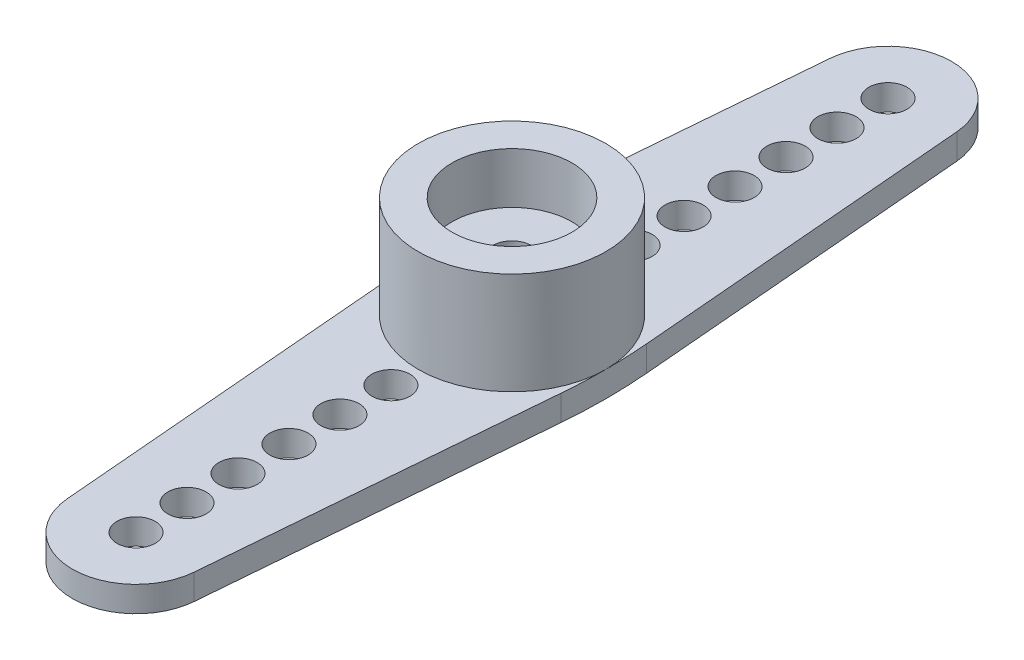
ISO-10303-21;
HEADER;
FILE_DESCRIPTION(('STEP AP214'),'2;1');
FILE_NAME('part.step','',(''),(''),'','','');
FILE_SCHEMA(('AUTOMOTIVE_DESIGN { 1 0 10303 214 1 1 1 1 }'));
ENDSEC;
DATA;
#1=APPLICATION_CONTEXT('core data for automotive mechanical design processes');
#2=APPLICATION_PROTOCOL_DEFINITION('international standard','automotive_design',2000,#1);
#3=PRODUCT_CONTEXT('',#1,'mechanical');
#4=PRODUCT('Part','Part','',(#3));
#5=PRODUCT_RELATED_PRODUCT_CATEGORY('part','',(#4));
#6=PRODUCT_DEFINITION_FORMATION('','',#4);
#7=PRODUCT_DEFINITION_CONTEXT('part definition',#1,'design');
#8=PRODUCT_DEFINITION('design','',#6,#7);
#9=PRODUCT_DEFINITION_SHAPE('','',#8);
#10=(LENGTH_UNIT() NAMED_UNIT(*) SI_UNIT(.MILLI.,.METRE.));
#11=(NAMED_UNIT(*) PLANE_ANGLE_UNIT() SI_UNIT($,.RADIAN.));
#12=(NAMED_UNIT(*) SI_UNIT($,.STERADIAN.) SOLID_ANGLE_UNIT());
#13=UNCERTAINTY_MEASURE_WITH_UNIT(LENGTH_MEASURE(1.E-05),#10,'distance_accuracy_value','');
#14=(GEOMETRIC_REPRESENTATION_CONTEXT(3) GLOBAL_UNCERTAINTY_ASSIGNED_CONTEXT((#13)) GLOBAL_UNIT_ASSIGNED_CONTEXT((#10,
#11,#12)) REPRESENTATION_CONTEXT('',''));
#15=CARTESIAN_POINT('',(0.,0.,0.));
#16=DIRECTION('',(0.,0.,1.));
#17=DIRECTION('',(1.,0.,0.));
#18=AXIS2_PLACEMENT_3D('',#15,#16,#17);
#19=CARTESIAN_POINT('',(0.,5.,0.));
#20=DIRECTION('',(0.,-1.,0.));
#21=DIRECTION('',(0.,0.,-1.));
#22=AXIS2_PLACEMENT_3D('',#19,#20,#21);
#23=CYLINDRICAL_SURFACE('',#22,0.75);
#24=CARTESIAN_POINT('',(0.,0.5,0.));
#25=DIRECTION('',(0.,-1.,0.));
#26=DIRECTION('',(0.,0.,-1.));
#27=AXIS2_PLACEMENT_3D('',#24,#25,#26);
#28=CIRCLE('',#27,0.75);
#29=CARTESIAN_POINT('',(0.,0.5,-0.75));
#30=VERTEX_POINT('',#29);
#31=EDGE_CURVE('E175',#30,#30,#28,.F.);
#32=ORIENTED_EDGE('',*,*,#31,.F.);
#33=EDGE_LOOP('',(#32));
#34=FACE_BOUND('',#33,.T.);
#35=CARTESIAN_POINT('',(0.,3.,0.));
#36=DIRECTION('',(0.,1.,0.));
#37=DIRECTION('',(0.,0.,1.));
#38=AXIS2_PLACEMENT_3D('',#35,#36,#37);
#39=CIRCLE('',#38,0.75);
#40=CARTESIAN_POINT('',(0.,3.,0.75));
#41=VERTEX_POINT('',#40);
#42=EDGE_CURVE('E40',#41,#41,#39,.T.);
#43=ORIENTED_EDGE('',*,*,#42,.T.);
#44=EDGE_LOOP('',(#43));
#45=FACE_BOUND('',#44,.T.);
#46=ADVANCED_FACE('F36',(#34,#45),#23,.F.);
#47=CARTESIAN_POINT('',(0.,1.,-14.75));
#48=DIRECTION('',(0.,-1.,0.));
#49=DIRECTION('',(0.,0.,-1.));
#50=AXIS2_PLACEMENT_3D('',#47,#48,#49);
#51=PLANE('',#50);
#52=CARTESIAN_POINT('',(0.,1.,14.75));
#53=DIRECTION('',(0.,1.,0.));
#54=DIRECTION('',(0.,0.,-1.));
#55=AXIS2_PLACEMENT_3D('',#52,#53,#54);
#56=CIRCLE('',#55,0.75);
#57=CARTESIAN_POINT('',(0.,1.,14.));
#58=VERTEX_POINT('',#57);
#59=EDGE_CURVE('E202',#58,#58,#56,.T.);
#60=ORIENTED_EDGE('',*,*,#59,.F.);
#61=EDGE_LOOP('',(#60));
#62=FACE_BOUND('',#61,.T.);
#63=CARTESIAN_POINT('',(0.,1.,12.75));
#64=DIRECTION('',(0.,1.,0.));
#65=DIRECTION('',(0.,0.,-1.));
#66=AXIS2_PLACEMENT_3D('',#63,#64,#65);
#67=CIRCLE('',#66,0.75);
#68=CARTESIAN_POINT('',(0.,1.,12.));
#69=VERTEX_POINT('',#68);
#70=EDGE_CURVE('E209',#69,#69,#67,.T.);
#71=ORIENTED_EDGE('',*,*,#70,.F.);
#72=EDGE_LOOP('',(#71));
#73=FACE_BOUND('',#72,.T.);
#74=CARTESIAN_POINT('',(0.,1.,10.75));
#75=DIRECTION('',(0.,1.,0.));
#76=DIRECTION('',(0.,0.,-1.));
#77=AXIS2_PLACEMENT_3D('',#74,#75,#76);
#78=CIRCLE('',#77,0.75);
#79=CARTESIAN_POINT('',(0.,1.,10.));
#80=VERTEX_POINT('',#79);
#81=EDGE_CURVE('E215',#80,#80,#78,.T.);
#82=ORIENTED_EDGE('',*,*,#81,.F.);
#83=EDGE_LOOP('',(#82));
#84=FACE_BOUND('',#83,.T.);
#85=CARTESIAN_POINT('',(0.,1.,8.75));
#86=DIRECTION('',(0.,1.,0.));
#87=DIRECTION('',(0.,0.,-1.));
#88=AXIS2_PLACEMENT_3D('',#85,#86,#87);
#89=CIRCLE('',#88,0.75);
#90=CARTESIAN_POINT('',(0.,1.,8.));
#91=VERTEX_POINT('',#90);
#92=EDGE_CURVE('E221',#91,#91,#89,.T.);
#93=ORIENTED_EDGE('',*,*,#92,.F.);
#94=EDGE_LOOP('',(#93));
#95=FACE_BOUND('',#94,.T.);
#96=CARTESIAN_POINT('',(0.,1.,6.75));
#97=DIRECTION('',(0.,1.,0.));
#98=DIRECTION('',(0.,0.,-1.));
#99=AXIS2_PLACEMENT_3D('',#96,#97,#98);
#100=CIRCLE('',#99,0.75);
#101=CARTESIAN_POINT('',(0.,1.,6.));
#102=VERTEX_POINT('',#101);
#103=EDGE_CURVE('E227',#102,#102,#100,.T.);
#104=ORIENTED_EDGE('',*,*,#103,.F.);
#105=EDGE_LOOP('',(#104));
#106=FACE_BOUND('',#105,.T.);
#107=CARTESIAN_POINT('',(1.04744440165294E-13,1.,4.75));
#108=DIRECTION('',(0.,1.,0.));
#109=DIRECTION('',(0.,0.,-1.));
#110=AXIS2_PLACEMENT_3D('',#107,#108,#109);
#111=CIRCLE('',#110,0.75);
#112=CARTESIAN_POINT('',(1.04744440165294E-13,1.,4.));
#113=VERTEX_POINT('',#112);
#114=EDGE_CURVE('E233',#113,#113,#111,.T.);
#115=ORIENTED_EDGE('',*,*,#114,.F.);
#116=EDGE_LOOP('',(#115));
#117=FACE_BOUND('',#116,.T.);
#118=CARTESIAN_POINT('',(-16.3206818802518,1.,0.));
#119=DIRECTION('',(0.,1.,0.));
#120=DIRECTION('',(0.,0.,1.));
#121=AXIS2_PLACEMENT_3D('',#118,#119,#120);
#122=CIRCLE('',#121,20.);
#123=CARTESIAN_POINT('',(3.60888515621104,1.,1.67700856859233));
#124=VERTEX_POINT('',#123);
#125=CARTESIAN_POINT('',(3.67931811974816,1.,0.));
#126=VERTEX_POINT('',#125);
#127=EDGE_CURVE('E122',#124,#126,#122,.T.);
#128=ORIENTED_EDGE('',*,*,#127,.T.);
#129=CARTESIAN_POINT('',(0.,1.,0.));
#130=DIRECTION('',(0.,-1.,0.));
#131=DIRECTION('',(0.,0.,-1.));
#132=AXIS2_PLACEMENT_3D('',#129,#130,#131);
#133=CIRCLE('',#132,3.67931811974816);
#134=CARTESIAN_POINT('',(-3.67931811974816,1.,0.));
#135=VERTEX_POINT('',#134);
#136=EDGE_CURVE('E52',#126,#135,#133,.T.);
#137=ORIENTED_EDGE('',*,*,#136,.T.);
#138=CARTESIAN_POINT('',(16.3206818802518,1.,0.));
#139=DIRECTION('',(0.,1.,0.));
#140=DIRECTION('',(0.,0.,1.));
#141=AXIS2_PLACEMENT_3D('',#138,#139,#140);
#142=CIRCLE('',#141,20.);
#143=CARTESIAN_POINT('',(-3.60888515621104,1.,1.67700856859234));
#144=VERTEX_POINT('',#143);
#145=EDGE_CURVE('E275',#135,#144,#142,.T.);
#146=ORIENTED_EDGE('',*,*,#145,.T.);
#147=DIRECTION('',(0.0838504284296133,0.,0.996478351823144));
#148=VECTOR('',#147,1.);
#149=CARTESIAN_POINT('',(-3.60888515621104,1.,1.67700856859233));
#150=LINE('',#149,#148);
#151=CARTESIAN_POINT('',(-2.49119587955786,1.,14.959626071074));
#152=VERTEX_POINT('',#151);
#153=EDGE_CURVE('E279',#144,#152,#150,.T.);
#154=ORIENTED_EDGE('',*,*,#153,.T.);
#155=CARTESIAN_POINT('',(0.,1.,14.75));
#156=DIRECTION('',(0.,1.,0.));
#157=DIRECTION('',(0.,0.,1.));
#158=AXIS2_PLACEMENT_3D('',#155,#156,#157);
#159=CIRCLE('',#158,2.49999999999999);
#160=CARTESIAN_POINT('',(2.49119587955786,1.,14.959626071074));
#161=VERTEX_POINT('',#160);
#162=EDGE_CURVE('E124',#152,#161,#159,.T.);
#163=ORIENTED_EDGE('',*,*,#162,.T.);
#164=DIRECTION('',(0.0838504284296133,0.,-0.996478351823144));
#165=VECTOR('',#164,1.);
#166=CARTESIAN_POINT('',(3.60888515621104,1.,1.67700856859233));
#167=LINE('',#166,#165);
#168=EDGE_CURVE('E118',#161,#124,#167,.T.);
#169=ORIENTED_EDGE('',*,*,#168,.T.);
#170=EDGE_LOOP('',(#128,#137,#146,#154,#163,#169));
#171=FACE_BOUND('',#170,.T.);
#172=ADVANCED_FACE('F120',(#62,#73,#84,#95,#106,#117,#171),#51,.F.);
#173=CARTESIAN_POINT('',(-3.60888515621104,1.,-1.67700856859233));
#174=VERTEX_POINT('',#173);
#175=EDGE_CURVE('E276',#174,#135,#142,.T.);
#176=ORIENTED_EDGE('',*,*,#175,.T.);
#177=EDGE_CURVE('E200',#135,#126,#133,.T.);
#178=ORIENTED_EDGE('',*,*,#177,.T.);
#179=CARTESIAN_POINT('',(3.60888515621104,1.,-1.67700856859233));
#180=VERTEX_POINT('',#179);
#181=EDGE_CURVE('E128',#126,#180,#122,.T.);
#182=ORIENTED_EDGE('',*,*,#181,.T.);
#183=DIRECTION('',(-0.083850428429613,0.,-0.996478351823144));
#184=VECTOR('',#183,1.);
#185=CARTESIAN_POINT('',(2.49119587955786,1.,-14.959626071074));
#186=LINE('',#185,#184);
#187=CARTESIAN_POINT('',(2.49119587955786,1.,-14.959626071074));
#188=VERTEX_POINT('',#187);
#189=EDGE_CURVE('E61',#180,#188,#186,.T.);
#190=ORIENTED_EDGE('',*,*,#189,.T.);
#191=CARTESIAN_POINT('',(0.,1.,-14.75));
#192=DIRECTION('',(0.,1.,0.));
#193=DIRECTION('',(0.,0.,-1.));
#194=AXIS2_PLACEMENT_3D('',#191,#192,#193);
#195=CIRCLE('',#194,2.5);
#196=CARTESIAN_POINT('',(-2.49119587955786,1.,-14.959626071074));
#197=VERTEX_POINT('',#196);
#198=EDGE_CURVE('E164',#188,#197,#195,.T.);
#199=ORIENTED_EDGE('',*,*,#198,.T.);
#200=DIRECTION('',(-0.083850428429613,0.,0.996478351823144));
#201=VECTOR('',#200,1.);
#202=CARTESIAN_POINT('',(-2.49119587955786,1.,-14.959626071074));
#203=LINE('',#202,#201);
#204=EDGE_CURVE('E102',#197,#174,#203,.T.);
#205=ORIENTED_EDGE('',*,*,#204,.T.);
#206=EDGE_LOOP('',(#176,#178,#182,#190,#199,#205));
#207=FACE_BOUND('',#206,.T.);
#208=CARTESIAN_POINT('',(0.,1.,-14.75));
#209=DIRECTION('',(0.,1.,0.));
#210=DIRECTION('',(0.,0.,1.));
#211=AXIS2_PLACEMENT_3D('',#208,#209,#210);
#212=CIRCLE('',#211,0.75);
#213=CARTESIAN_POINT('',(0.,1.,-14.));
#214=VERTEX_POINT('',#213);
#215=EDGE_CURVE('E152',#214,#214,#212,.T.);
#216=ORIENTED_EDGE('',*,*,#215,.F.);
#217=EDGE_LOOP('',(#216));
#218=FACE_BOUND('',#217,.T.);
#219=CARTESIAN_POINT('',(0.,1.,-12.75));
#220=DIRECTION('',(0.,1.,0.));
#221=DIRECTION('',(0.,0.,1.));
#222=AXIS2_PLACEMENT_3D('',#219,#220,#221);
#223=CIRCLE('',#222,0.750000000000019);
#224=CARTESIAN_POINT('',(0.,1.,-12.));
#225=VERTEX_POINT('',#224);
#226=EDGE_CURVE('E263',#225,#225,#223,.T.);
#227=ORIENTED_EDGE('',*,*,#226,.F.);
#228=EDGE_LOOP('',(#227));
#229=FACE_BOUND('',#228,.T.);
#230=CARTESIAN_POINT('',(0.,1.,-10.75));
#231=DIRECTION('',(0.,1.,0.));
#232=DIRECTION('',(0.,0.,1.));
#233=AXIS2_PLACEMENT_3D('',#230,#231,#232);
#234=CIRCLE('',#233,0.75);
#235=CARTESIAN_POINT('',(0.,1.,-10.));
#236=VERTEX_POINT('',#235);
#237=EDGE_CURVE('E257',#236,#236,#234,.T.);
#238=ORIENTED_EDGE('',*,*,#237,.F.);
#239=EDGE_LOOP('',(#238));
#240=FACE_BOUND('',#239,.T.);
#241=CARTESIAN_POINT('',(0.,1.,-8.75));
#242=DIRECTION('',(0.,1.,0.));
#243=DIRECTION('',(0.,0.,1.));
#244=AXIS2_PLACEMENT_3D('',#241,#242,#243);
#245=CIRCLE('',#244,0.75);
#246=CARTESIAN_POINT('',(0.,1.,-8.));
#247=VERTEX_POINT('',#246);
#248=EDGE_CURVE('E251',#247,#247,#245,.T.);
#249=ORIENTED_EDGE('',*,*,#248,.F.);
#250=EDGE_LOOP('',(#249));
#251=FACE_BOUND('',#250,.T.);
#252=CARTESIAN_POINT('',(0.,1.,-6.75));
#253=DIRECTION('',(0.,1.,0.));
#254=DIRECTION('',(0.,0.,1.));
#255=AXIS2_PLACEMENT_3D('',#252,#253,#254);
#256=CIRCLE('',#255,0.75);
#257=CARTESIAN_POINT('',(0.,1.,-6.));
#258=VERTEX_POINT('',#257);
#259=EDGE_CURVE('E245',#258,#258,#256,.T.);
#260=ORIENTED_EDGE('',*,*,#259,.F.);
#261=EDGE_LOOP('',(#260));
#262=FACE_BOUND('',#261,.T.);
#263=CARTESIAN_POINT('',(1.04744440165294E-13,1.,-4.75));
#264=DIRECTION('',(0.,1.,0.));
#265=DIRECTION('',(0.,0.,1.));
#266=AXIS2_PLACEMENT_3D('',#263,#264,#265);
#267=CIRCLE('',#266,0.75);
#268=CARTESIAN_POINT('',(1.04744440165294E-13,1.,-4.));
#269=VERTEX_POINT('',#268);
#270=EDGE_CURVE('E239',#269,#269,#267,.T.);
#271=ORIENTED_EDGE('',*,*,#270,.F.);
#272=EDGE_LOOP('',(#271));
#273=FACE_BOUND('',#272,.T.);
#274=ADVANCED_FACE('F298',(#207,#218,#229,#240,#251,#262,#273),#51,.F.);
#275=CARTESIAN_POINT('',(0.,0.,-14.75));
#276=DIRECTION('',(0.,-1.,0.));
#277=DIRECTION('',(0.,0.,-1.));
#278=AXIS2_PLACEMENT_3D('',#275,#276,#277);
#279=PLANE('',#278);
#280=CARTESIAN_POINT('',(0.,0.,0.));
#281=DIRECTION('',(0.,-1.,0.));
#282=DIRECTION('',(0.,0.,-1.));
#283=AXIS2_PLACEMENT_3D('',#280,#281,#282);
#284=CIRCLE('',#283,1.5);
#285=CARTESIAN_POINT('',(0.,0.,-1.5));
#286=VERTEX_POINT('',#285);
#287=EDGE_CURVE('E177',#286,#286,#284,.T.);
#288=ORIENTED_EDGE('',*,*,#287,.F.);
#289=EDGE_LOOP('',(#288));
#290=FACE_BOUND('',#289,.T.);
#291=DIRECTION('',(-0.083850428429613,0.,-0.996478351823144));
#292=VECTOR('',#291,1.);
#293=CARTESIAN_POINT('',(2.49119587955786,0.,-14.959626071074));
#294=LINE('',#293,#292);
#295=CARTESIAN_POINT('',(3.60888515621104,0.,-1.67700856859233));
#296=VERTEX_POINT('',#295);
#297=CARTESIAN_POINT('',(2.49119587955786,0.,-14.959626071074));
#298=VERTEX_POINT('',#297);
#299=EDGE_CURVE('E94',#296,#298,#294,.T.);
#300=ORIENTED_EDGE('',*,*,#299,.F.);
#301=CARTESIAN_POINT('',(-16.3206818802518,0.,0.));
#302=DIRECTION('',(0.,1.,0.));
#303=DIRECTION('',(0.,0.,1.));
#304=AXIS2_PLACEMENT_3D('',#301,#302,#303);
#305=CIRCLE('',#304,20.);
#306=CARTESIAN_POINT('',(3.60888515621104,0.,1.67700856859233));
#307=VERTEX_POINT('',#306);
#308=EDGE_CURVE('E161',#307,#296,#305,.T.);
#309=ORIENTED_EDGE('',*,*,#308,.F.);
#310=DIRECTION('',(0.0838504284296133,0.,-0.996478351823144));
#311=VECTOR('',#310,1.);
#312=CARTESIAN_POINT('',(3.60888515621104,0.,1.67700856859233));
#313=LINE('',#312,#311);
#314=CARTESIAN_POINT('',(2.49119587955786,0.,14.959626071074));
#315=VERTEX_POINT('',#314);
#316=EDGE_CURVE('E134',#315,#307,#313,.T.);
#317=ORIENTED_EDGE('',*,*,#316,.F.);
#318=CARTESIAN_POINT('',(0.,0.,14.75));
#319=DIRECTION('',(0.,1.,0.));
#320=DIRECTION('',(0.,0.,1.));
#321=AXIS2_PLACEMENT_3D('',#318,#319,#320);
#322=CIRCLE('',#321,2.49999999999999);
#323=CARTESIAN_POINT('',(-2.49119587955786,0.,14.959626071074));
#324=VERTEX_POINT('',#323);
#325=EDGE_CURVE('E158',#324,#315,#322,.T.);
#326=ORIENTED_EDGE('',*,*,#325,.F.);
#327=DIRECTION('',(0.0838504284296133,0.,0.996478351823144));
#328=VECTOR('',#327,1.);
#329=CARTESIAN_POINT('',(-3.60888515621104,0.,1.67700856859233));
#330=LINE('',#329,#328);
#331=CARTESIAN_POINT('',(-3.60888515621104,0.,1.67700856859234));
#332=VERTEX_POINT('',#331);
#333=EDGE_CURVE('E156',#332,#324,#330,.T.);
#334=ORIENTED_EDGE('',*,*,#333,.F.);
#335=CARTESIAN_POINT('',(16.3206818802518,0.,0.));
#336=DIRECTION('',(0.,1.,0.));
#337=DIRECTION('',(0.,0.,1.));
#338=AXIS2_PLACEMENT_3D('',#335,#336,#337);
#339=CIRCLE('',#338,20.);
#340=CARTESIAN_POINT('',(-3.60888515621104,0.,-1.67700856859233));
#341=VERTEX_POINT('',#340);
#342=EDGE_CURVE('E154',#341,#332,#339,.T.);
#343=ORIENTED_EDGE('',*,*,#342,.F.);
#344=DIRECTION('',(-0.083850428429613,0.,0.996478351823144));
#345=VECTOR('',#344,1.);
#346=CARTESIAN_POINT('',(-2.49119587955786,0.,-14.959626071074));
#347=LINE('',#346,#345);
#348=CARTESIAN_POINT('',(-2.49119587955786,0.,-14.959626071074));
#349=VERTEX_POINT('',#348);
#350=EDGE_CURVE('E151',#349,#341,#347,.T.);
#351=ORIENTED_EDGE('',*,*,#350,.F.);
#352=CARTESIAN_POINT('',(0.,0.,-14.75));
#353=DIRECTION('',(0.,1.,0.));
#354=DIRECTION('',(0.,0.,-1.));
#355=AXIS2_PLACEMENT_3D('',#352,#353,#354);
#356=CIRCLE('',#355,2.5);
#357=EDGE_CURVE('E148',#298,#349,#356,.T.);
#358=ORIENTED_EDGE('',*,*,#357,.F.);
#359=EDGE_LOOP('',(#300,#309,#317,#326,#334,#343,#351,#358));
#360=FACE_BOUND('',#359,.T.);
#361=CARTESIAN_POINT('',(0.,0.,-6.75));
#362=DIRECTION('',(0.,1.,0.));
#363=DIRECTION('',(0.,0.,1.));
#364=AXIS2_PLACEMENT_3D('',#361,#362,#363);
#365=CIRCLE('',#364,0.75);
#366=CARTESIAN_POINT('',(0.,0.,-6.));
#367=VERTEX_POINT('',#366);
#368=EDGE_CURVE('E242',#367,#367,#365,.T.);
#369=ORIENTED_EDGE('',*,*,#368,.T.);
#370=EDGE_LOOP('',(#369));
#371=FACE_BOUND('',#370,.T.);
#372=CARTESIAN_POINT('',(0.,0.,-10.75));
#373=DIRECTION('',(0.,1.,0.));
#374=DIRECTION('',(0.,0.,1.));
#375=AXIS2_PLACEMENT_3D('',#372,#373,#374);
#376=CIRCLE('',#375,0.75);
#377=CARTESIAN_POINT('',(0.,0.,-10.));
#378=VERTEX_POINT('',#377);
#379=EDGE_CURVE('E254',#378,#378,#376,.T.);
#380=ORIENTED_EDGE('',*,*,#379,.T.);
#381=EDGE_LOOP('',(#380));
#382=FACE_BOUND('',#381,.T.);
#383=CARTESIAN_POINT('',(0.,0.,-14.75));
#384=DIRECTION('',(0.,1.,0.));
#385=DIRECTION('',(0.,0.,1.));
#386=AXIS2_PLACEMENT_3D('',#383,#384,#385);
#387=CIRCLE('',#386,0.75);
#388=CARTESIAN_POINT('',(0.,0.,-14.));
#389=VERTEX_POINT('',#388);
#390=EDGE_CURVE('E266',#389,#389,#387,.T.);
#391=ORIENTED_EDGE('',*,*,#390,.T.);
#392=EDGE_LOOP('',(#391));
#393=FACE_BOUND('',#392,.T.);
#394=CARTESIAN_POINT('',(0.,0.,-12.75));
#395=DIRECTION('',(0.,1.,0.));
#396=DIRECTION('',(0.,0.,1.));
#397=AXIS2_PLACEMENT_3D('',#394,#395,#396);
#398=CIRCLE('',#397,0.750000000000019);
#399=CARTESIAN_POINT('',(0.,0.,-12.));
#400=VERTEX_POINT('',#399);
#401=EDGE_CURVE('E260',#400,#400,#398,.T.);
#402=ORIENTED_EDGE('',*,*,#401,.T.);
#403=EDGE_LOOP('',(#402));
#404=FACE_BOUND('',#403,.T.);
#405=CARTESIAN_POINT('',(0.,0.,-8.75));
#406=DIRECTION('',(0.,1.,0.));
#407=DIRECTION('',(0.,0.,1.));
#408=AXIS2_PLACEMENT_3D('',#405,#406,#407);
#409=CIRCLE('',#408,0.75);
#410=CARTESIAN_POINT('',(0.,0.,-8.));
#411=VERTEX_POINT('',#410);
#412=EDGE_CURVE('E248',#411,#411,#409,.T.);
#413=ORIENTED_EDGE('',*,*,#412,.T.);
#414=EDGE_LOOP('',(#413));
#415=FACE_BOUND('',#414,.T.);
#416=CARTESIAN_POINT('',(1.04744440165294E-13,0.,-4.75));
#417=DIRECTION('',(0.,1.,0.));
#418=DIRECTION('',(0.,0.,1.));
#419=AXIS2_PLACEMENT_3D('',#416,#417,#418);
#420=CIRCLE('',#419,0.75);
#421=CARTESIAN_POINT('',(1.04744440165294E-13,0.,-4.));
#422=VERTEX_POINT('',#421);
#423=EDGE_CURVE('E236',#422,#422,#420,.T.);
#424=ORIENTED_EDGE('',*,*,#423,.T.);
#425=EDGE_LOOP('',(#424));
#426=FACE_BOUND('',#425,.T.);
#427=CARTESIAN_POINT('',(0.,0.,14.75));
#428=DIRECTION('',(0.,1.,0.));
#429=DIRECTION('',(0.,0.,-1.));
#430=AXIS2_PLACEMENT_3D('',#427,#428,#429);
#431=CIRCLE('',#430,0.75);
#432=CARTESIAN_POINT('',(0.,0.,14.));
#433=VERTEX_POINT('',#432);
#434=EDGE_CURVE('E206',#433,#433,#431,.T.);
#435=ORIENTED_EDGE('',*,*,#434,.T.);
#436=EDGE_LOOP('',(#435));
#437=FACE_BOUND('',#436,.T.);
#438=CARTESIAN_POINT('',(0.,0.,10.75));
#439=DIRECTION('',(0.,1.,0.));
#440=DIRECTION('',(0.,0.,-1.));
#441=AXIS2_PLACEMENT_3D('',#438,#439,#440);
#442=CIRCLE('',#441,0.75);
#443=CARTESIAN_POINT('',(0.,0.,10.));
#444=VERTEX_POINT('',#443);
#445=EDGE_CURVE('E212',#444,#444,#442,.T.);
#446=ORIENTED_EDGE('',*,*,#445,.T.);
#447=EDGE_LOOP('',(#446));
#448=FACE_BOUND('',#447,.T.);
#449=CARTESIAN_POINT('',(0.,0.,6.75));
#450=DIRECTION('',(0.,1.,0.));
#451=DIRECTION('',(0.,0.,-1.));
#452=AXIS2_PLACEMENT_3D('',#449,#450,#451);
#453=CIRCLE('',#452,0.75);
#454=CARTESIAN_POINT('',(0.,0.,6.));
#455=VERTEX_POINT('',#454);
#456=EDGE_CURVE('E224',#455,#455,#453,.T.);
#457=ORIENTED_EDGE('',*,*,#456,.T.);
#458=EDGE_LOOP('',(#457));
#459=FACE_BOUND('',#458,.T.);
#460=CARTESIAN_POINT('',(1.04744440165294E-13,0.,4.75));
#461=DIRECTION('',(0.,1.,0.));
#462=DIRECTION('',(0.,0.,-1.));
#463=AXIS2_PLACEMENT_3D('',#460,#461,#462);
#464=CIRCLE('',#463,0.75);
#465=CARTESIAN_POINT('',(1.04744440165294E-13,0.,4.));
#466=VERTEX_POINT('',#465);
#467=EDGE_CURVE('E230',#466,#466,#464,.T.);
#468=ORIENTED_EDGE('',*,*,#467,.T.);
#469=EDGE_LOOP('',(#468));
#470=FACE_BOUND('',#469,.T.);
#471=CARTESIAN_POINT('',(0.,0.,8.75));
#472=DIRECTION('',(0.,1.,0.));
#473=DIRECTION('',(0.,0.,-1.));
#474=AXIS2_PLACEMENT_3D('',#471,#472,#473);
#475=CIRCLE('',#474,0.75);
#476=CARTESIAN_POINT('',(0.,0.,8.));
#477=VERTEX_POINT('',#476);
#478=EDGE_CURVE('E218',#477,#477,#475,.T.);
#479=ORIENTED_EDGE('',*,*,#478,.T.);
#480=EDGE_LOOP('',(#479));
#481=FACE_BOUND('',#480,.T.);
#482=CARTESIAN_POINT('',(0.,0.,12.75));
#483=DIRECTION('',(0.,1.,0.));
#484=DIRECTION('',(0.,0.,-1.));
#485=AXIS2_PLACEMENT_3D('',#482,#483,#484);
#486=CIRCLE('',#485,0.75);
#487=CARTESIAN_POINT('',(0.,0.,12.));
#488=VERTEX_POINT('',#487);
#489=EDGE_CURVE('E205',#488,#488,#486,.T.);
#490=ORIENTED_EDGE('',*,*,#489,.T.);
#491=EDGE_LOOP('',(#490));
#492=FACE_BOUND('',#491,.T.);
#493=ADVANCED_FACE('F291',(#290,#360,#371,#382,#393,#404,#415,#426,#437,#448,#459,#470,#481,
#492),#279,.T.);
#494=CARTESIAN_POINT('',(0.,1.,-14.75));
#495=DIRECTION('',(0.,-1.,0.));
#496=DIRECTION('',(0.,0.,-1.));
#497=AXIS2_PLACEMENT_3D('',#494,#495,#496);
#498=CYLINDRICAL_SURFACE('',#497,2.5);
#499=ORIENTED_EDGE('',*,*,#357,.T.);
#500=DIRECTION('',(0.,-1.,0.));
#501=VECTOR('',#500,1.);
#502=CARTESIAN_POINT('',(-2.49119587955786,1.,-14.959626071074));
#503=LINE('',#502,#501);
#504=EDGE_CURVE('E11',#197,#349,#503,.T.);
#505=ORIENTED_EDGE('',*,*,#504,.F.);
#506=ORIENTED_EDGE('',*,*,#198,.F.);
#507=DIRECTION('',(0.,-1.,0.));
#508=VECTOR('',#507,1.);
#509=CARTESIAN_POINT('',(2.49119587955786,1.,-14.959626071074));
#510=LINE('',#509,#508);
#511=EDGE_CURVE('E144',#188,#298,#510,.T.);
#512=ORIENTED_EDGE('',*,*,#511,.T.);
#513=EDGE_LOOP('',(#499,#505,#506,#512));
#514=FACE_BOUND('',#513,.T.);
#515=ADVANCED_FACE('F38',(#514),#498,.T.);
#516=CARTESIAN_POINT('',(-2.49119587955786,1.,-14.959626071074));
#517=DIRECTION('',(0.996478351823144,0.,0.083850428429613));
#518=DIRECTION('',(0.083850428429613,0.,-0.996478351823144));
#519=AXIS2_PLACEMENT_3D('',#516,#517,#518);
#520=PLANE('',#519);
#521=ORIENTED_EDGE('',*,*,#350,.T.);
#522=DIRECTION('',(0.,-1.,0.));
#523=VECTOR('',#522,1.);
#524=CARTESIAN_POINT('',(-3.60888515621104,1.,-1.67700856859233));
#525=LINE('',#524,#523);
#526=EDGE_CURVE('E45',#174,#341,#525,.T.);
#527=ORIENTED_EDGE('',*,*,#526,.F.);
#528=ORIENTED_EDGE('',*,*,#204,.F.);
#529=ORIENTED_EDGE('',*,*,#504,.T.);
#530=EDGE_LOOP('',(#521,#527,#528,#529));
#531=FACE_BOUND('',#530,.T.);
#532=ADVANCED_FACE('F301',(#531),#520,.F.);
#533=CARTESIAN_POINT('',(16.3206818802518,1.,0.));
#534=DIRECTION('',(0.,-1.,0.));
#535=DIRECTION('',(0.,0.,-1.));
#536=AXIS2_PLACEMENT_3D('',#533,#534,#535);
#537=CYLINDRICAL_SURFACE('',#536,20.);
#538=ORIENTED_EDGE('',*,*,#145,.F.);
#539=ORIENTED_EDGE('',*,*,#175,.F.);
#540=ORIENTED_EDGE('',*,*,#526,.T.);
#541=ORIENTED_EDGE('',*,*,#342,.T.);
#542=DIRECTION('',(0.,-1.,0.));
#543=VECTOR('',#542,1.);
#544=CARTESIAN_POINT('',(-3.60888515621104,1.,1.67700856859234));
#545=LINE('',#544,#543);
#546=EDGE_CURVE('E171',#144,#332,#545,.T.);
#547=ORIENTED_EDGE('',*,*,#546,.F.);
#548=EDGE_LOOP('',(#538,#539,#540,#541,#547));
#549=FACE_BOUND('',#548,.T.);
#550=ADVANCED_FACE('F304',(#549),#537,.T.);
#551=CARTESIAN_POINT('',(-3.60888515621104,1.,1.67700856859233));
#552=DIRECTION('',(0.996478351823144,0.,-0.0838504284296133));
#553=DIRECTION('',(-0.0838504284296133,0.,-0.996478351823144));
#554=AXIS2_PLACEMENT_3D('',#551,#552,#553);
#555=PLANE('',#554);
#556=ORIENTED_EDGE('',*,*,#333,.T.);
#557=DIRECTION('',(0.,-1.,0.));
#558=VECTOR('',#557,1.);
#559=CARTESIAN_POINT('',(-2.49119587955786,1.,14.959626071074));
#560=LINE('',#559,#558);
#561=EDGE_CURVE('E168',#152,#324,#560,.T.);
#562=ORIENTED_EDGE('',*,*,#561,.F.);
#563=ORIENTED_EDGE('',*,*,#153,.F.);
#564=ORIENTED_EDGE('',*,*,#546,.T.);
#565=EDGE_LOOP('',(#556,#562,#563,#564));
#566=FACE_BOUND('',#565,.T.);
#567=ADVANCED_FACE('F285',(#566),#555,.F.);
#568=CARTESIAN_POINT('',(0.,1.,14.75));
#569=DIRECTION('',(0.,-1.,0.));
#570=DIRECTION('',(0.,0.,-1.));
#571=AXIS2_PLACEMENT_3D('',#568,#569,#570);
#572=CYLINDRICAL_SURFACE('',#571,2.49999999999999);
#573=ORIENTED_EDGE('',*,*,#325,.T.);
#574=DIRECTION('',(0.,-1.,0.));
#575=VECTOR('',#574,1.);
#576=CARTESIAN_POINT('',(2.49119587955786,1.,14.959626071074));
#577=LINE('',#576,#575);
#578=EDGE_CURVE('E137',#161,#315,#577,.T.);
#579=ORIENTED_EDGE('',*,*,#578,.F.);
#580=ORIENTED_EDGE('',*,*,#162,.F.);
#581=ORIENTED_EDGE('',*,*,#561,.T.);
#582=EDGE_LOOP('',(#573,#579,#580,#581));
#583=FACE_BOUND('',#582,.T.);
#584=ADVANCED_FACE('F289',(#583),#572,.T.);
#585=CARTESIAN_POINT('',(3.60888515621104,1.,1.67700856859233));
#586=DIRECTION('',(-0.996478351823144,0.,-0.0838504284296133));
#587=DIRECTION('',(-0.0838504284296133,0.,0.996478351823144));
#588=AXIS2_PLACEMENT_3D('',#585,#586,#587);
#589=PLANE('',#588);
#590=ORIENTED_EDGE('',*,*,#316,.T.);
#591=DIRECTION('',(0.,-1.,0.));
#592=VECTOR('',#591,1.);
#593=CARTESIAN_POINT('',(3.60888515621104,1.,1.67700856859233));
#594=LINE('',#593,#592);
#595=EDGE_CURVE('E131',#124,#307,#594,.T.);
#596=ORIENTED_EDGE('',*,*,#595,.F.);
#597=ORIENTED_EDGE('',*,*,#168,.F.);
#598=ORIENTED_EDGE('',*,*,#578,.T.);
#599=EDGE_LOOP('',(#590,#596,#597,#598));
#600=FACE_BOUND('',#599,.T.);
#601=ADVANCED_FACE('F132',(#600),#589,.F.);
#602=CARTESIAN_POINT('',(-16.3206818802518,1.,0.));
#603=DIRECTION('',(0.,-1.,0.));
#604=DIRECTION('',(0.,0.,-1.));
#605=AXIS2_PLACEMENT_3D('',#602,#603,#604);
#606=CYLINDRICAL_SURFACE('',#605,20.);
#607=ORIENTED_EDGE('',*,*,#181,.F.);
#608=ORIENTED_EDGE('',*,*,#127,.F.);
#609=ORIENTED_EDGE('',*,*,#595,.T.);
#610=ORIENTED_EDGE('',*,*,#308,.T.);
#611=DIRECTION('',(0.,-1.,0.));
#612=VECTOR('',#611,1.);
#613=CARTESIAN_POINT('',(3.60888515621104,1.,-1.67700856859233));
#614=LINE('',#613,#612);
#615=EDGE_CURVE('E138',#180,#296,#614,.T.);
#616=ORIENTED_EDGE('',*,*,#615,.F.);
#617=EDGE_LOOP('',(#607,#608,#609,#610,#616));
#618=FACE_BOUND('',#617,.T.);
#619=ADVANCED_FACE('F141',(#618),#606,.T.);
#620=CARTESIAN_POINT('',(2.49119587955786,1.,-14.959626071074));
#621=DIRECTION('',(-0.996478351823144,0.,0.083850428429613));
#622=DIRECTION('',(0.083850428429613,0.,0.996478351823144));
#623=AXIS2_PLACEMENT_3D('',#620,#621,#622);
#624=PLANE('',#623);
#625=ORIENTED_EDGE('',*,*,#299,.T.);
#626=ORIENTED_EDGE('',*,*,#511,.F.);
#627=ORIENTED_EDGE('',*,*,#189,.F.);
#628=ORIENTED_EDGE('',*,*,#615,.T.);
#629=EDGE_LOOP('',(#625,#626,#627,#628));
#630=FACE_BOUND('',#629,.T.);
#631=ADVANCED_FACE('F294',(#630),#624,.F.);
#632=CARTESIAN_POINT('',(0.,1.,-14.75));
#633=DIRECTION('',(0.,-1.,0.));
#634=DIRECTION('',(0.,0.,-1.));
#635=AXIS2_PLACEMENT_3D('',#632,#633,#634);
#636=CYLINDRICAL_SURFACE('',#635,0.75);
#637=ORIENTED_EDGE('',*,*,#215,.T.);
#638=EDGE_LOOP('',(#637));
#639=FACE_BOUND('',#638,.T.);
#640=ORIENTED_EDGE('',*,*,#390,.F.);
#641=EDGE_LOOP('',(#640));
#642=FACE_BOUND('',#641,.T.);
#643=ADVANCED_FACE('F354',(#639,#642),#636,.F.);
#644=CARTESIAN_POINT('',(0.,1.,-12.75));
#645=DIRECTION('',(0.,-1.,0.));
#646=DIRECTION('',(0.,0.,-1.));
#647=AXIS2_PLACEMENT_3D('',#644,#645,#646);
#648=CYLINDRICAL_SURFACE('',#647,0.750000000000019);
#649=ORIENTED_EDGE('',*,*,#226,.T.);
#650=EDGE_LOOP('',(#649));
#651=FACE_BOUND('',#650,.T.);
#652=ORIENTED_EDGE('',*,*,#401,.F.);
#653=EDGE_LOOP('',(#652));
#654=FACE_BOUND('',#653,.T.);
#655=ADVANCED_FACE('F400',(#651,#654),#648,.F.);
#656=CARTESIAN_POINT('',(0.,1.,-10.75));
#657=DIRECTION('',(0.,-1.,0.));
#658=DIRECTION('',(0.,0.,-1.));
#659=AXIS2_PLACEMENT_3D('',#656,#657,#658);
#660=CYLINDRICAL_SURFACE('',#659,0.75);
#661=ORIENTED_EDGE('',*,*,#237,.T.);
#662=EDGE_LOOP('',(#661));
#663=FACE_BOUND('',#662,.T.);
#664=ORIENTED_EDGE('',*,*,#379,.F.);
#665=EDGE_LOOP('',(#664));
#666=FACE_BOUND('',#665,.T.);
#667=ADVANCED_FACE('F407',(#663,#666),#660,.F.);
#668=CARTESIAN_POINT('',(0.,1.,-8.75));
#669=DIRECTION('',(0.,-1.,0.));
#670=DIRECTION('',(0.,0.,-1.));
#671=AXIS2_PLACEMENT_3D('',#668,#669,#670);
#672=CYLINDRICAL_SURFACE('',#671,0.75);
#673=ORIENTED_EDGE('',*,*,#248,.T.);
#674=EDGE_LOOP('',(#673));
#675=FACE_BOUND('',#674,.T.);
#676=ORIENTED_EDGE('',*,*,#412,.F.);
#677=EDGE_LOOP('',(#676));
#678=FACE_BOUND('',#677,.T.);
#679=ADVANCED_FACE('F415',(#675,#678),#672,.F.);
#680=CARTESIAN_POINT('',(0.,1.,-6.75));
#681=DIRECTION('',(0.,-1.,0.));
#682=DIRECTION('',(0.,0.,-1.));
#683=AXIS2_PLACEMENT_3D('',#680,#681,#682);
#684=CYLINDRICAL_SURFACE('',#683,0.75);
#685=ORIENTED_EDGE('',*,*,#259,.T.);
#686=EDGE_LOOP('',(#685));
#687=FACE_BOUND('',#686,.T.);
#688=ORIENTED_EDGE('',*,*,#368,.F.);
#689=EDGE_LOOP('',(#688));
#690=FACE_BOUND('',#689,.T.);
#691=ADVANCED_FACE('F423',(#687,#690),#684,.F.);
#692=CARTESIAN_POINT('',(1.04744440165294E-13,1.,-4.75));
#693=DIRECTION('',(0.,-1.,0.));
#694=DIRECTION('',(0.,0.,-1.));
#695=AXIS2_PLACEMENT_3D('',#692,#693,#694);
#696=CYLINDRICAL_SURFACE('',#695,0.75);
#697=ORIENTED_EDGE('',*,*,#270,.T.);
#698=EDGE_LOOP('',(#697));
#699=FACE_BOUND('',#698,.T.);
#700=ORIENTED_EDGE('',*,*,#423,.F.);
#701=EDGE_LOOP('',(#700));
#702=FACE_BOUND('',#701,.T.);
#703=ADVANCED_FACE('F431',(#699,#702),#696,.F.);
#704=CARTESIAN_POINT('',(1.04744440165294E-13,1.,4.75));
#705=DIRECTION('',(0.,-1.,0.));
#706=DIRECTION('',(0.,0.,-1.));
#707=AXIS2_PLACEMENT_3D('',#704,#705,#706);
#708=CYLINDRICAL_SURFACE('',#707,0.75);
#709=ORIENTED_EDGE('',*,*,#114,.T.);
#710=EDGE_LOOP('',(#709));
#711=FACE_BOUND('',#710,.T.);
#712=ORIENTED_EDGE('',*,*,#467,.F.);
#713=EDGE_LOOP('',(#712));
#714=FACE_BOUND('',#713,.T.);
#715=ADVANCED_FACE('F439',(#711,#714),#708,.F.);
#716=CARTESIAN_POINT('',(0.,1.,6.75));
#717=DIRECTION('',(0.,-1.,0.));
#718=DIRECTION('',(0.,0.,-1.));
#719=AXIS2_PLACEMENT_3D('',#716,#717,#718);
#720=CYLINDRICAL_SURFACE('',#719,0.75);
#721=ORIENTED_EDGE('',*,*,#103,.T.);
#722=EDGE_LOOP('',(#721));
#723=FACE_BOUND('',#722,.T.);
#724=ORIENTED_EDGE('',*,*,#456,.F.);
#725=EDGE_LOOP('',(#724));
#726=FACE_BOUND('',#725,.T.);
#727=ADVANCED_FACE('F447',(#723,#726),#720,.F.);
#728=CARTESIAN_POINT('',(0.,1.,8.75));
#729=DIRECTION('',(0.,-1.,0.));
#730=DIRECTION('',(0.,0.,-1.));
#731=AXIS2_PLACEMENT_3D('',#728,#729,#730);
#732=CYLINDRICAL_SURFACE('',#731,0.75);
#733=ORIENTED_EDGE('',*,*,#92,.T.);
#734=EDGE_LOOP('',(#733));
#735=FACE_BOUND('',#734,.T.);
#736=ORIENTED_EDGE('',*,*,#478,.F.);
#737=EDGE_LOOP('',(#736));
#738=FACE_BOUND('',#737,.T.);
#739=ADVANCED_FACE('F455',(#735,#738),#732,.F.);
#740=CARTESIAN_POINT('',(0.,1.,10.75));
#741=DIRECTION('',(0.,-1.,0.));
#742=DIRECTION('',(0.,0.,-1.));
#743=AXIS2_PLACEMENT_3D('',#740,#741,#742);
#744=CYLINDRICAL_SURFACE('',#743,0.75);
#745=ORIENTED_EDGE('',*,*,#81,.T.);
#746=EDGE_LOOP('',(#745));
#747=FACE_BOUND('',#746,.T.);
#748=ORIENTED_EDGE('',*,*,#445,.F.);
#749=EDGE_LOOP('',(#748));
#750=FACE_BOUND('',#749,.T.);
#751=ADVANCED_FACE('F463',(#747,#750),#744,.F.);
#752=CARTESIAN_POINT('',(0.,1.,12.75));
#753=DIRECTION('',(0.,-1.,0.));
#754=DIRECTION('',(0.,0.,-1.));
#755=AXIS2_PLACEMENT_3D('',#752,#753,#754);
#756=CYLINDRICAL_SURFACE('',#755,0.75);
#757=ORIENTED_EDGE('',*,*,#70,.T.);
#758=EDGE_LOOP('',(#757));
#759=FACE_BOUND('',#758,.T.);
#760=ORIENTED_EDGE('',*,*,#489,.F.);
#761=EDGE_LOOP('',(#760));
#762=FACE_BOUND('',#761,.T.);
#763=ADVANCED_FACE('F318',(#759,#762),#756,.F.);
#764=CARTESIAN_POINT('',(0.,1.,14.75));
#765=DIRECTION('',(0.,-1.,0.));
#766=DIRECTION('',(0.,0.,-1.));
#767=AXIS2_PLACEMENT_3D('',#764,#765,#766);
#768=CYLINDRICAL_SURFACE('',#767,0.75);
#769=ORIENTED_EDGE('',*,*,#59,.T.);
#770=EDGE_LOOP('',(#769));
#771=FACE_BOUND('',#770,.T.);
#772=ORIENTED_EDGE('',*,*,#434,.F.);
#773=EDGE_LOOP('',(#772));
#774=FACE_BOUND('',#773,.T.);
#775=ADVANCED_FACE('F308',(#771,#774),#768,.F.);
#776=CARTESIAN_POINT('',(0.,5.,0.));
#777=DIRECTION('',(0.,-1.,0.));
#778=DIRECTION('',(0.,0.,-1.));
#779=AXIS2_PLACEMENT_3D('',#776,#777,#778);
#780=CYLINDRICAL_SURFACE('',#779,3.67931811974816);
#781=CARTESIAN_POINT('',(0.,5.,0.));
#782=DIRECTION('',(0.,-1.,0.));
#783=DIRECTION('',(0.,0.,-1.));
#784=AXIS2_PLACEMENT_3D('',#781,#782,#783);
#785=CIRCLE('',#784,3.67931811974816);
#786=CARTESIAN_POINT('',(0.,5.,-3.67931811974816));
#787=VERTEX_POINT('',#786);
#788=EDGE_CURVE('E196',#787,#787,#785,.T.);
#789=ORIENTED_EDGE('',*,*,#788,.T.);
#790=EDGE_LOOP('',(#789));
#791=FACE_BOUND('',#790,.T.);
#792=ORIENTED_EDGE('',*,*,#136,.F.);
#793=ORIENTED_EDGE('',*,*,#177,.F.);
#794=EDGE_LOOP('',(#792,#793));
#795=FACE_BOUND('',#794,.T.);
#796=ADVANCED_FACE('F305',(#791,#795),#780,.T.);
#797=CARTESIAN_POINT('',(0.,5.,0.));
#798=DIRECTION('',(0.,-1.,0.));
#799=DIRECTION('',(0.,0.,-1.));
#800=AXIS2_PLACEMENT_3D('',#797,#798,#799);
#801=PLANE('',#800);
#802=CARTESIAN_POINT('',(0.,5.,0.));
#803=DIRECTION('',(0.,1.,0.));
#804=DIRECTION('',(0.,0.,1.));
#805=AXIS2_PLACEMENT_3D('',#802,#803,#804);
#806=CIRCLE('',#805,2.355);
#807=CARTESIAN_POINT('',(0.,5.,2.355));
#808=VERTEX_POINT('',#807);
#809=EDGE_CURVE('E188',#808,#808,#806,.T.);
#810=ORIENTED_EDGE('',*,*,#809,.F.);
#811=EDGE_LOOP('',(#810));
#812=FACE_BOUND('',#811,.T.);
#813=ORIENTED_EDGE('',*,*,#788,.F.);
#814=EDGE_LOOP('',(#813));
#815=FACE_BOUND('',#814,.T.);
#816=ADVANCED_FACE('F307',(#812,#815),#801,.F.);
#817=CARTESIAN_POINT('',(0.,0.5,0.));
#818=DIRECTION('',(0.,-1.,0.));
#819=DIRECTION('',(0.,0.,-1.));
#820=AXIS2_PLACEMENT_3D('',#817,#818,#819);
#821=CYLINDRICAL_SURFACE('',#820,1.5);
#822=CARTESIAN_POINT('',(0.,0.5,0.));
#823=DIRECTION('',(0.,-1.,0.));
#824=DIRECTION('',(0.,0.,-1.));
#825=AXIS2_PLACEMENT_3D('',#822,#823,#824);
#826=CIRCLE('',#825,1.5);
#827=CARTESIAN_POINT('',(0.,0.5,-1.5));
#828=VERTEX_POINT('',#827);
#829=EDGE_CURVE('E181',#828,#828,#826,.T.);
#830=ORIENTED_EDGE('',*,*,#829,.F.);
#831=EDGE_LOOP('',(#830));
#832=FACE_BOUND('',#831,.T.);
#833=ORIENTED_EDGE('',*,*,#287,.T.);
#834=EDGE_LOOP('',(#833));
#835=FACE_BOUND('',#834,.T.);
#836=ADVANCED_FACE('F315',(#832,#835),#821,.F.);
#837=CARTESIAN_POINT('',(0.,0.5,0.));
#838=DIRECTION('',(0.,-1.,0.));
#839=DIRECTION('',(0.,0.,-1.));
#840=AXIS2_PLACEMENT_3D('',#837,#838,#839);
#841=PLANE('',#840);
#842=ORIENTED_EDGE('',*,*,#31,.T.);
#843=EDGE_LOOP('',(#842));
#844=FACE_BOUND('',#843,.T.);
#845=ORIENTED_EDGE('',*,*,#829,.T.);
#846=EDGE_LOOP('',(#845));
#847=FACE_BOUND('',#846,.T.);
#848=ADVANCED_FACE('F333',(#844,#847),#841,.T.);
#849=CARTESIAN_POINT('',(0.,3.,0.));
#850=DIRECTION('',(0.,1.,0.));
#851=DIRECTION('',(0.,0.,1.));
#852=AXIS2_PLACEMENT_3D('',#849,#850,#851);
#853=CYLINDRICAL_SURFACE('',#852,2.355);
#854=CARTESIAN_POINT('',(0.,3.,0.));
#855=DIRECTION('',(0.,1.,0.));
#856=DIRECTION('',(0.,0.,1.));
#857=AXIS2_PLACEMENT_3D('',#854,#855,#856);
#858=CIRCLE('',#857,2.355);
#859=CARTESIAN_POINT('',(0.,3.,2.355));
#860=VERTEX_POINT('',#859);
#861=EDGE_CURVE('E184',#860,#860,#858,.T.);
#862=ORIENTED_EDGE('',*,*,#861,.F.);
#863=EDGE_LOOP('',(#862));
#864=FACE_BOUND('',#863,.T.);
#865=ORIENTED_EDGE('',*,*,#809,.T.);
#866=EDGE_LOOP('',(#865));
#867=FACE_BOUND('',#866,.T.);
#868=ADVANCED_FACE('F331',(#864,#867),#853,.F.);
#869=CARTESIAN_POINT('',(0.,3.,0.));
#870=DIRECTION('',(0.,1.,0.));
#871=DIRECTION('',(0.,0.,1.));
#872=AXIS2_PLACEMENT_3D('',#869,#870,#871);
#873=PLANE('',#872);
#874=ORIENTED_EDGE('',*,*,#42,.F.);
#875=EDGE_LOOP('',(#874));
#876=FACE_BOUND('',#875,.T.);
#877=ORIENTED_EDGE('',*,*,#861,.T.);
#878=EDGE_LOOP('',(#877));
#879=FACE_BOUND('',#878,.T.);
#880=ADVANCED_FACE('F573',(#876,#879),#873,.T.);
#881=CLOSED_SHELL('',(#46,#172,#274,#493,#515,#532,#550,#567,#584,#601,#619,#631,#643,#655,#667,
#679,#691,#703,#715,#727,#739,#751,#763,#775,#796,#816,#836,#848,#868,#880));
#882=MANIFOLD_SOLID_BREP('B2',#881);
#883=ADVANCED_BREP_SHAPE_REPRESENTATION('',(#18,#882),#14);
#884=SHAPE_DEFINITION_REPRESENTATION(#9,#883);
ENDSEC;
END-ISO-10303-21;
